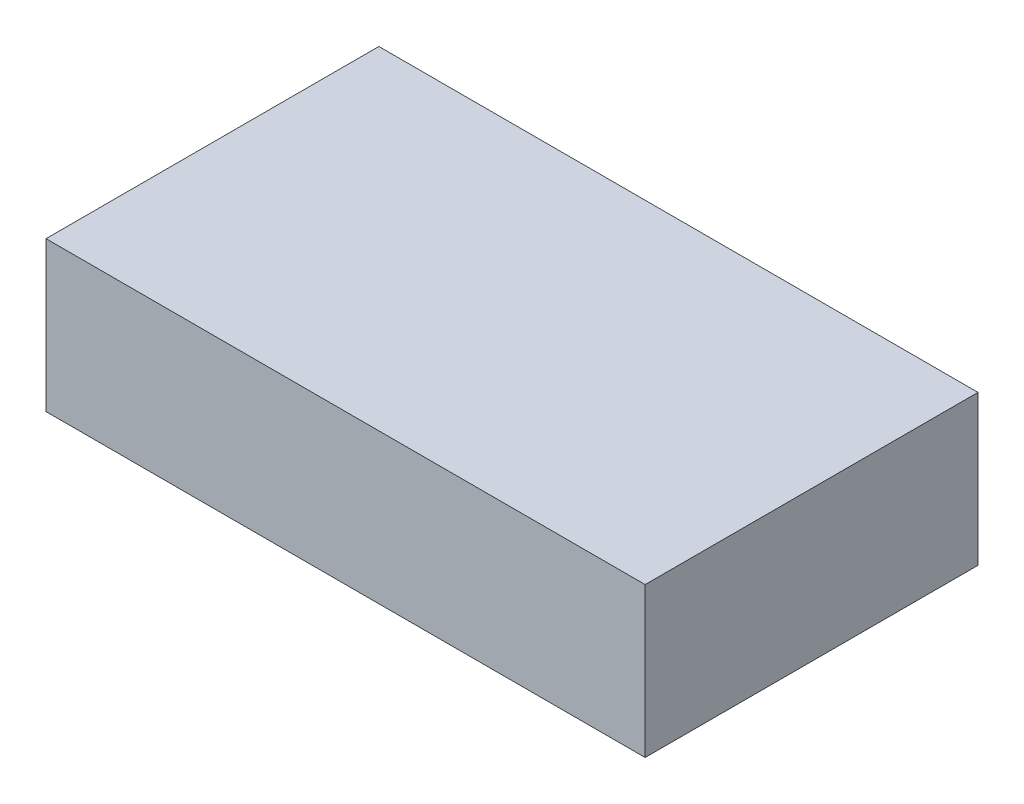
ISO-10303-21;
HEADER;
FILE_DESCRIPTION(('STEP AP214'),'2;1');
FILE_NAME('part.step','',(''),(''),'','','');
FILE_SCHEMA(('AUTOMOTIVE_DESIGN { 1 0 10303 214 1 1 1 1 }'));
ENDSEC;
DATA;
#1=APPLICATION_CONTEXT('core data for automotive mechanical design processes');
#2=APPLICATION_PROTOCOL_DEFINITION('international standard','automotive_design',2000,#1);
#3=PRODUCT_CONTEXT('',#1,'mechanical');
#4=PRODUCT('Part','Part','',(#3));
#5=PRODUCT_RELATED_PRODUCT_CATEGORY('part','',(#4));
#6=PRODUCT_DEFINITION_FORMATION('','',#4);
#7=PRODUCT_DEFINITION_CONTEXT('part definition',#1,'design');
#8=PRODUCT_DEFINITION('design','',#6,#7);
#9=PRODUCT_DEFINITION_SHAPE('','',#8);
#10=(LENGTH_UNIT() NAMED_UNIT(*) SI_UNIT(.MILLI.,.METRE.));
#11=(NAMED_UNIT(*) PLANE_ANGLE_UNIT() SI_UNIT($,.RADIAN.));
#12=(NAMED_UNIT(*) SI_UNIT($,.STERADIAN.) SOLID_ANGLE_UNIT());
#13=UNCERTAINTY_MEASURE_WITH_UNIT(LENGTH_MEASURE(1.E-05),#10,'distance_accuracy_value','');
#14=(GEOMETRIC_REPRESENTATION_CONTEXT(3) GLOBAL_UNCERTAINTY_ASSIGNED_CONTEXT((#13)) GLOBAL_UNIT_ASSIGNED_CONTEXT((#10,
#11,#12)) REPRESENTATION_CONTEXT('',''));
#15=CARTESIAN_POINT('',(0.,0.,0.));
#16=DIRECTION('',(0.,0.,1.));
#17=DIRECTION('',(1.,0.,0.));
#18=AXIS2_PLACEMENT_3D('',#15,#16,#17);
#19=CARTESIAN_POINT('',(0.,14.2875,0.));
#20=DIRECTION('',(1.,0.,0.));
#21=DIRECTION('',(0.,0.,-1.));
#22=AXIS2_PLACEMENT_3D('',#19,#20,#21);
#23=PLANE('',#22);
#24=DIRECTION('',(0.,0.,1.));
#25=VECTOR('',#24,1.);
#26=CARTESIAN_POINT('',(0.,0.,0.));
#27=LINE('',#26,#25);
#28=CARTESIAN_POINT('',(0.,0.,-31.75));
#29=VERTEX_POINT('',#28);
#30=CARTESIAN_POINT('',(0.,0.,0.));
#31=VERTEX_POINT('',#30);
#32=EDGE_CURVE('E107',#29,#31,#27,.T.);
#33=ORIENTED_EDGE('',*,*,#32,.T.);
#34=DIRECTION('',(0.,-1.,0.));
#35=VECTOR('',#34,1.);
#36=CARTESIAN_POINT('',(0.,14.2875,0.));
#37=LINE('',#36,#35);
#38=CARTESIAN_POINT('',(0.,14.2875,0.));
#39=VERTEX_POINT('',#38);
#40=EDGE_CURVE('E11',#39,#31,#37,.T.);
#41=ORIENTED_EDGE('',*,*,#40,.F.);
#42=DIRECTION('',(0.,0.,1.));
#43=VECTOR('',#42,1.);
#44=CARTESIAN_POINT('',(0.,14.2875,0.));
#45=LINE('',#44,#43);
#46=CARTESIAN_POINT('',(0.,14.2875,-31.75));
#47=VERTEX_POINT('',#46);
#48=EDGE_CURVE('E91',#47,#39,#45,.T.);
#49=ORIENTED_EDGE('',*,*,#48,.F.);
#50=DIRECTION('',(0.,-1.,0.));
#51=VECTOR('',#50,1.);
#52=CARTESIAN_POINT('',(0.,14.2875,-31.75));
#53=LINE('',#52,#51);
#54=EDGE_CURVE('E103',#47,#29,#53,.T.);
#55=ORIENTED_EDGE('',*,*,#54,.T.);
#56=EDGE_LOOP('',(#33,#41,#49,#55));
#57=FACE_BOUND('',#56,.T.);
#58=ADVANCED_FACE('F39',(#57),#23,.F.);
#59=CARTESIAN_POINT('',(0.,14.2875,0.));
#60=DIRECTION('',(0.,0.,-1.));
#61=DIRECTION('',(-1.,0.,0.));
#62=AXIS2_PLACEMENT_3D('',#59,#60,#61);
#63=PLANE('',#62);
#64=DIRECTION('',(1.,0.,0.));
#65=VECTOR('',#64,1.);
#66=CARTESIAN_POINT('',(0.,0.,0.));
#67=LINE('',#66,#65);
#68=CARTESIAN_POINT('',(57.15,0.,0.));
#69=VERTEX_POINT('',#68);
#70=EDGE_CURVE('E96',#31,#69,#67,.T.);
#71=ORIENTED_EDGE('',*,*,#70,.T.);
#72=DIRECTION('',(0.,-1.,0.));
#73=VECTOR('',#72,1.);
#74=CARTESIAN_POINT('',(57.15,14.2875,0.));
#75=LINE('',#74,#73);
#76=CARTESIAN_POINT('',(57.15,14.2875,0.));
#77=VERTEX_POINT('',#76);
#78=EDGE_CURVE('E48',#77,#69,#75,.T.);
#79=ORIENTED_EDGE('',*,*,#78,.F.);
#80=DIRECTION('',(1.,0.,0.));
#81=VECTOR('',#80,1.);
#82=CARTESIAN_POINT('',(0.,14.2875,0.));
#83=LINE('',#82,#81);
#84=EDGE_CURVE('E86',#39,#77,#83,.T.);
#85=ORIENTED_EDGE('',*,*,#84,.F.);
#86=ORIENTED_EDGE('',*,*,#40,.T.);
#87=EDGE_LOOP('',(#71,#79,#85,#86));
#88=FACE_BOUND('',#87,.T.);
#89=ADVANCED_FACE('F95',(#88),#63,.F.);
#90=CARTESIAN_POINT('',(57.15,14.2875,0.));
#91=DIRECTION('',(-1.,0.,0.));
#92=DIRECTION('',(0.,0.,1.));
#93=AXIS2_PLACEMENT_3D('',#90,#91,#92);
#94=PLANE('',#93);
#95=DIRECTION('',(0.,0.,-1.));
#96=VECTOR('',#95,1.);
#97=CARTESIAN_POINT('',(57.15,0.,0.));
#98=LINE('',#97,#96);
#99=CARTESIAN_POINT('',(57.15,0.,-31.75));
#100=VERTEX_POINT('',#99);
#101=EDGE_CURVE('E73',#69,#100,#98,.T.);
#102=ORIENTED_EDGE('',*,*,#101,.T.);
#103=DIRECTION('',(0.,-1.,0.));
#104=VECTOR('',#103,1.);
#105=CARTESIAN_POINT('',(57.15,14.2875,-31.75));
#106=LINE('',#105,#104);
#107=CARTESIAN_POINT('',(57.15,14.2875,-31.75));
#108=VERTEX_POINT('',#107);
#109=EDGE_CURVE('E98',#108,#100,#106,.T.);
#110=ORIENTED_EDGE('',*,*,#109,.F.);
#111=DIRECTION('',(0.,0.,-1.));
#112=VECTOR('',#111,1.);
#113=CARTESIAN_POINT('',(57.15,14.2875,0.));
#114=LINE('',#113,#112);
#115=EDGE_CURVE('E89',#77,#108,#114,.T.);
#116=ORIENTED_EDGE('',*,*,#115,.F.);
#117=ORIENTED_EDGE('',*,*,#78,.T.);
#118=EDGE_LOOP('',(#102,#110,#116,#117));
#119=FACE_BOUND('',#118,.T.);
#120=ADVANCED_FACE('F99',(#119),#94,.F.);
#121=CARTESIAN_POINT('',(0.,14.2875,-31.75));
#122=DIRECTION('',(0.,0.,1.));
#123=DIRECTION('',(1.,0.,0.));
#124=AXIS2_PLACEMENT_3D('',#121,#122,#123);
#125=PLANE('',#124);
#126=DIRECTION('',(-1.,0.,0.));
#127=VECTOR('',#126,1.);
#128=CARTESIAN_POINT('',(0.,0.,-31.75));
#129=LINE('',#128,#127);
#130=EDGE_CURVE('E79',#100,#29,#129,.T.);
#131=ORIENTED_EDGE('',*,*,#130,.T.);
#132=ORIENTED_EDGE('',*,*,#54,.F.);
#133=DIRECTION('',(-1.,0.,0.));
#134=VECTOR('',#133,1.);
#135=CARTESIAN_POINT('',(0.,14.2875,-31.75));
#136=LINE('',#135,#134);
#137=EDGE_CURVE('E56',#108,#47,#136,.T.);
#138=ORIENTED_EDGE('',*,*,#137,.F.);
#139=ORIENTED_EDGE('',*,*,#109,.T.);
#140=EDGE_LOOP('',(#131,#132,#138,#139));
#141=FACE_BOUND('',#140,.T.);
#142=ADVANCED_FACE('F120',(#141),#125,.F.);
#143=CARTESIAN_POINT('',(0.,14.2875,0.));
#144=DIRECTION('',(0.,-1.,0.));
#145=DIRECTION('',(0.,0.,-1.));
#146=AXIS2_PLACEMENT_3D('',#143,#144,#145);
#147=PLANE('',#146);
#148=ORIENTED_EDGE('',*,*,#48,.T.);
#149=ORIENTED_EDGE('',*,*,#84,.T.);
#150=ORIENTED_EDGE('',*,*,#115,.T.);
#151=ORIENTED_EDGE('',*,*,#137,.T.);
#152=EDGE_LOOP('',(#148,#149,#150,#151));
#153=FACE_BOUND('',#152,.T.);
#154=ADVANCED_FACE('F87',(#153),#147,.F.);
#155=CARTESIAN_POINT('',(0.,0.,0.));
#156=DIRECTION('',(0.,-1.,0.));
#157=DIRECTION('',(0.,0.,-1.));
#158=AXIS2_PLACEMENT_3D('',#155,#156,#157);
#159=PLANE('',#158);
#160=ORIENTED_EDGE('',*,*,#32,.F.);
#161=ORIENTED_EDGE('',*,*,#130,.F.);
#162=ORIENTED_EDGE('',*,*,#101,.F.);
#163=ORIENTED_EDGE('',*,*,#70,.F.);
#164=EDGE_LOOP('',(#160,#161,#162,#163));
#165=FACE_BOUND('',#164,.T.);
#166=ADVANCED_FACE('F123',(#165),#159,.T.);
#167=CLOSED_SHELL('',(#58,#89,#120,#142,#154,#166));
#168=MANIFOLD_SOLID_BREP('B2',#167);
#169=ADVANCED_BREP_SHAPE_REPRESENTATION('',(#18,#168),#14);
#170=SHAPE_DEFINITION_REPRESENTATION(#9,#169);
ENDSEC;
END-ISO-10303-21;
